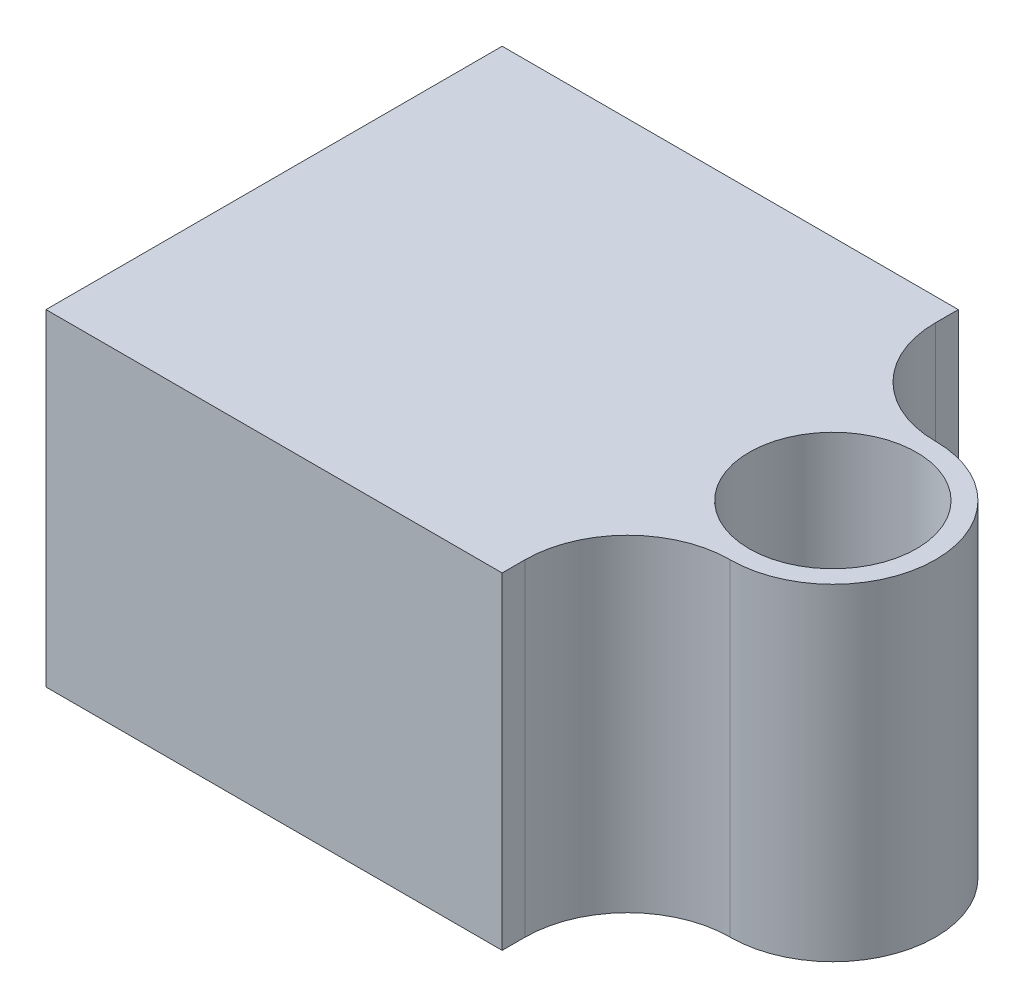
ISO-10303-21;
HEADER;
FILE_DESCRIPTION(('STEP AP214'),'2;1');
FILE_NAME('part.step','',(''),(''),'','','');
FILE_SCHEMA(('AUTOMOTIVE_DESIGN { 1 0 10303 214 1 1 1 1 }'));
ENDSEC;
DATA;
#1=APPLICATION_CONTEXT('core data for automotive mechanical design processes');
#2=APPLICATION_PROTOCOL_DEFINITION('international standard','automotive_design',2000,#1);
#3=PRODUCT_CONTEXT('',#1,'mechanical');
#4=PRODUCT('Part','Part','',(#3));
#5=PRODUCT_RELATED_PRODUCT_CATEGORY('part','',(#4));
#6=PRODUCT_DEFINITION_FORMATION('','',#4);
#7=PRODUCT_DEFINITION_CONTEXT('part definition',#1,'design');
#8=PRODUCT_DEFINITION('design','',#6,#7);
#9=PRODUCT_DEFINITION_SHAPE('','',#8);
#10=(LENGTH_UNIT() NAMED_UNIT(*) SI_UNIT(.MILLI.,.METRE.));
#11=(NAMED_UNIT(*) PLANE_ANGLE_UNIT() SI_UNIT($,.RADIAN.));
#12=(NAMED_UNIT(*) SI_UNIT($,.STERADIAN.) SOLID_ANGLE_UNIT());
#13=UNCERTAINTY_MEASURE_WITH_UNIT(LENGTH_MEASURE(1.E-05),#10,'distance_accuracy_value','');
#14=(GEOMETRIC_REPRESENTATION_CONTEXT(3) GLOBAL_UNCERTAINTY_ASSIGNED_CONTEXT((#13)) GLOBAL_UNIT_ASSIGNED_CONTEXT((#10,
#11,#12)) REPRESENTATION_CONTEXT('',''));
#15=CARTESIAN_POINT('',(0.,0.,0.));
#16=DIRECTION('',(0.,0.,1.));
#17=DIRECTION('',(1.,0.,0.));
#18=AXIS2_PLACEMENT_3D('',#15,#16,#17);
#19=CARTESIAN_POINT('',(0.,21.5,0.));
#20=DIRECTION('',(0.,-1.,0.));
#21=DIRECTION('',(0.,0.,-1.));
#22=AXIS2_PLACEMENT_3D('',#19,#20,#21);
#23=CYLINDRICAL_SURFACE('',#22,13.5);
#24=CARTESIAN_POINT('',(0.,-21.5,0.));
#25=DIRECTION('',(0.,1.,0.));
#26=DIRECTION('',(0.,0.,1.));
#27=AXIS2_PLACEMENT_3D('',#24,#25,#26);
#28=CIRCLE('',#27,13.5);
#29=CARTESIAN_POINT('',(0.,-21.5,13.5));
#30=VERTEX_POINT('',#29);
#31=CARTESIAN_POINT('',(0.,-21.5,-13.5));
#32=VERTEX_POINT('',#31);
#33=EDGE_CURVE('E198',#30,#32,#28,.T.);
#34=ORIENTED_EDGE('',*,*,#33,.T.);
#35=DIRECTION('',(0.,-1.,0.));
#36=VECTOR('',#35,1.);
#37=CARTESIAN_POINT('',(0.,21.5,-13.5));
#38=LINE('',#37,#36);
#39=CARTESIAN_POINT('',(0.,21.5,-13.5));
#40=VERTEX_POINT('',#39);
#41=EDGE_CURVE('E11',#40,#32,#38,.T.);
#42=ORIENTED_EDGE('',*,*,#41,.F.);
#43=CARTESIAN_POINT('',(0.,21.5,0.));
#44=DIRECTION('',(0.,1.,0.));
#45=DIRECTION('',(0.,0.,1.));
#46=AXIS2_PLACEMENT_3D('',#43,#44,#45);
#47=CIRCLE('',#46,13.5);
#48=CARTESIAN_POINT('',(0.,21.5,13.5));
#49=VERTEX_POINT('',#48);
#50=EDGE_CURVE('E96',#49,#40,#47,.T.);
#51=ORIENTED_EDGE('',*,*,#50,.F.);
#52=DIRECTION('',(0.,-1.,0.));
#53=VECTOR('',#52,1.);
#54=CARTESIAN_POINT('',(0.,21.5,13.5));
#55=LINE('',#54,#53);
#56=EDGE_CURVE('E58',#49,#30,#55,.T.);
#57=ORIENTED_EDGE('',*,*,#56,.T.);
#58=EDGE_LOOP('',(#34,#42,#51,#57));
#59=FACE_BOUND('',#58,.T.);
#60=ADVANCED_FACE('F41',(#59),#23,.T.);
#61=CARTESIAN_POINT('',(0.,21.5,-27.));
#62=DIRECTION('',(0.,-1.,0.));
#63=DIRECTION('',(0.,0.,-1.));
#64=AXIS2_PLACEMENT_3D('',#61,#62,#63);
#65=CYLINDRICAL_SURFACE('',#64,13.5);
#66=CARTESIAN_POINT('',(0.,-21.5,-27.));
#67=DIRECTION('',(0.,1.,0.));
#68=DIRECTION('',(0.,0.,1.));
#69=AXIS2_PLACEMENT_3D('',#66,#67,#68);
#70=CIRCLE('',#69,13.5);
#71=CARTESIAN_POINT('',(-13.5,-21.5,-27.));
#72=VERTEX_POINT('',#71);
#73=EDGE_CURVE('E191',#72,#32,#70,.T.);
#74=ORIENTED_EDGE('',*,*,#73,.F.);
#75=DIRECTION('',(0.,-1.,0.));
#76=VECTOR('',#75,1.);
#77=CARTESIAN_POINT('',(-13.5,21.5,-27.));
#78=LINE('',#77,#76);
#79=CARTESIAN_POINT('',(-13.5,21.5,-27.));
#80=VERTEX_POINT('',#79);
#81=EDGE_CURVE('E50',#80,#72,#78,.T.);
#82=ORIENTED_EDGE('',*,*,#81,.F.);
#83=CARTESIAN_POINT('',(0.,21.5,-27.));
#84=DIRECTION('',(0.,1.,0.));
#85=DIRECTION('',(0.,0.,1.));
#86=AXIS2_PLACEMENT_3D('',#83,#84,#85);
#87=CIRCLE('',#86,13.5);
#88=EDGE_CURVE('E146',#80,#40,#87,.T.);
#89=ORIENTED_EDGE('',*,*,#88,.T.);
#90=ORIENTED_EDGE('',*,*,#41,.T.);
#91=EDGE_LOOP('',(#74,#82,#89,#90));
#92=FACE_BOUND('',#91,.T.);
#93=ADVANCED_FACE('F196',(#92),#65,.F.);
#94=CARTESIAN_POINT('',(-13.5,21.5,0.));
#95=DIRECTION('',(-1.,0.,0.));
#96=DIRECTION('',(0.,0.,1.));
#97=AXIS2_PLACEMENT_3D('',#94,#95,#96);
#98=PLANE('',#97);
#99=DIRECTION('',(0.,0.,-1.));
#100=VECTOR('',#99,1.);
#101=CARTESIAN_POINT('',(-13.5,-21.5,0.));
#102=LINE('',#101,#100);
#103=CARTESIAN_POINT('',(-13.5,-21.5,-30.));
#104=VERTEX_POINT('',#103);
#105=EDGE_CURVE('E185',#72,#104,#102,.T.);
#106=ORIENTED_EDGE('',*,*,#105,.T.);
#107=DIRECTION('',(0.,-1.,0.));
#108=VECTOR('',#107,1.);
#109=CARTESIAN_POINT('',(-13.5,21.5,-30.));
#110=LINE('',#109,#108);
#111=CARTESIAN_POINT('',(-13.5,21.5,-30.));
#112=VERTEX_POINT('',#111);
#113=EDGE_CURVE('E178',#112,#104,#110,.T.);
#114=ORIENTED_EDGE('',*,*,#113,.F.);
#115=DIRECTION('',(0.,0.,-1.));
#116=VECTOR('',#115,1.);
#117=CARTESIAN_POINT('',(-13.5,21.5,0.));
#118=LINE('',#117,#116);
#119=EDGE_CURVE('E138',#80,#112,#118,.T.);
#120=ORIENTED_EDGE('',*,*,#119,.F.);
#121=ORIENTED_EDGE('',*,*,#81,.T.);
#122=EDGE_LOOP('',(#106,#114,#120,#121));
#123=FACE_BOUND('',#122,.T.);
#124=ADVANCED_FACE('F184',(#123),#98,.F.);
#125=CARTESIAN_POINT('',(0.,21.5,-30.));
#126=DIRECTION('',(0.,0.,1.));
#127=DIRECTION('',(1.,0.,0.));
#128=AXIS2_PLACEMENT_3D('',#125,#126,#127);
#129=PLANE('',#128);
#130=DIRECTION('',(-1.,0.,0.));
#131=VECTOR('',#130,1.);
#132=CARTESIAN_POINT('',(0.,-21.5,-30.));
#133=LINE('',#132,#131);
#134=CARTESIAN_POINT('',(-73.5,-21.5,-30.));
#135=VERTEX_POINT('',#134);
#136=EDGE_CURVE('E193',#104,#135,#133,.T.);
#137=ORIENTED_EDGE('',*,*,#136,.T.);
#138=DIRECTION('',(0.,-1.,0.));
#139=VECTOR('',#138,1.);
#140=CARTESIAN_POINT('',(-73.5,21.5,-30.));
#141=LINE('',#140,#139);
#142=CARTESIAN_POINT('',(-73.5,21.5,-30.));
#143=VERTEX_POINT('',#142);
#144=EDGE_CURVE('E174',#143,#135,#141,.T.);
#145=ORIENTED_EDGE('',*,*,#144,.F.);
#146=DIRECTION('',(-1.,0.,0.));
#147=VECTOR('',#146,1.);
#148=CARTESIAN_POINT('',(0.,21.5,-30.));
#149=LINE('',#148,#147);
#150=EDGE_CURVE('E145',#112,#143,#149,.T.);
#151=ORIENTED_EDGE('',*,*,#150,.F.);
#152=ORIENTED_EDGE('',*,*,#113,.T.);
#153=EDGE_LOOP('',(#137,#145,#151,#152));
#154=FACE_BOUND('',#153,.T.);
#155=ADVANCED_FACE('F228',(#154),#129,.F.);
#156=CARTESIAN_POINT('',(-73.5,21.5,0.));
#157=DIRECTION('',(1.,0.,0.));
#158=DIRECTION('',(0.,0.,-1.));
#159=AXIS2_PLACEMENT_3D('',#156,#157,#158);
#160=PLANE('',#159);
#161=DIRECTION('',(0.,0.,1.));
#162=VECTOR('',#161,1.);
#163=CARTESIAN_POINT('',(-73.5,-21.5,0.));
#164=LINE('',#163,#162);
#165=CARTESIAN_POINT('',(-73.5,-21.5,30.));
#166=VERTEX_POINT('',#165);
#167=EDGE_CURVE('E206',#135,#166,#164,.T.);
#168=ORIENTED_EDGE('',*,*,#167,.T.);
#169=DIRECTION('',(0.,-1.,0.));
#170=VECTOR('',#169,1.);
#171=CARTESIAN_POINT('',(-73.5,21.5,30.));
#172=LINE('',#171,#170);
#173=CARTESIAN_POINT('',(-73.5,21.5,30.));
#174=VERTEX_POINT('',#173);
#175=EDGE_CURVE('E132',#174,#166,#172,.T.);
#176=ORIENTED_EDGE('',*,*,#175,.F.);
#177=DIRECTION('',(0.,0.,1.));
#178=VECTOR('',#177,1.);
#179=CARTESIAN_POINT('',(-73.5,21.5,0.));
#180=LINE('',#179,#178);
#181=EDGE_CURVE('E118',#143,#174,#180,.T.);
#182=ORIENTED_EDGE('',*,*,#181,.F.);
#183=ORIENTED_EDGE('',*,*,#144,.T.);
#184=EDGE_LOOP('',(#168,#176,#182,#183));
#185=FACE_BOUND('',#184,.T.);
#186=ADVANCED_FACE('F232',(#185),#160,.F.);
#187=CARTESIAN_POINT('',(0.,21.5,30.));
#188=DIRECTION('',(0.,0.,-1.));
#189=DIRECTION('',(-1.,0.,0.));
#190=AXIS2_PLACEMENT_3D('',#187,#188,#189);
#191=PLANE('',#190);
#192=DIRECTION('',(1.,0.,0.));
#193=VECTOR('',#192,1.);
#194=CARTESIAN_POINT('',(0.,-21.5,30.));
#195=LINE('',#194,#193);
#196=CARTESIAN_POINT('',(-13.5,-21.5,30.));
#197=VERTEX_POINT('',#196);
#198=EDGE_CURVE('E128',#166,#197,#195,.T.);
#199=ORIENTED_EDGE('',*,*,#198,.T.);
#200=DIRECTION('',(0.,-1.,0.));
#201=VECTOR('',#200,1.);
#202=CARTESIAN_POINT('',(-13.5,21.5,30.));
#203=LINE('',#202,#201);
#204=CARTESIAN_POINT('',(-13.5,21.5,30.));
#205=VERTEX_POINT('',#204);
#206=EDGE_CURVE('E125',#205,#197,#203,.T.);
#207=ORIENTED_EDGE('',*,*,#206,.F.);
#208=DIRECTION('',(1.,0.,0.));
#209=VECTOR('',#208,1.);
#210=CARTESIAN_POINT('',(0.,21.5,30.));
#211=LINE('',#210,#209);
#212=EDGE_CURVE('E111',#174,#205,#211,.T.);
#213=ORIENTED_EDGE('',*,*,#212,.F.);
#214=ORIENTED_EDGE('',*,*,#175,.T.);
#215=EDGE_LOOP('',(#199,#207,#213,#214));
#216=FACE_BOUND('',#215,.T.);
#217=ADVANCED_FACE('F126',(#216),#191,.F.);
#218=CARTESIAN_POINT('',(-13.5,-21.5,27.));
#219=VERTEX_POINT('',#218);
#220=EDGE_CURVE('E164',#197,#219,#102,.T.);
#221=ORIENTED_EDGE('',*,*,#220,.T.);
#222=DIRECTION('',(0.,-1.,0.));
#223=VECTOR('',#222,1.);
#224=CARTESIAN_POINT('',(-13.5,21.5,27.));
#225=LINE('',#224,#223);
#226=CARTESIAN_POINT('',(-13.5,21.5,27.));
#227=VERTEX_POINT('',#226);
#228=EDGE_CURVE('E84',#227,#219,#225,.T.);
#229=ORIENTED_EDGE('',*,*,#228,.F.);
#230=EDGE_CURVE('E116',#205,#227,#118,.T.);
#231=ORIENTED_EDGE('',*,*,#230,.F.);
#232=ORIENTED_EDGE('',*,*,#206,.T.);
#233=EDGE_LOOP('',(#221,#229,#231,#232));
#234=FACE_BOUND('',#233,.T.);
#235=ADVANCED_FACE('F134',(#234),#98,.F.);
#236=CARTESIAN_POINT('',(0.,21.5,27.));
#237=DIRECTION('',(0.,-1.,0.));
#238=DIRECTION('',(0.,0.,-1.));
#239=AXIS2_PLACEMENT_3D('',#236,#237,#238);
#240=CYLINDRICAL_SURFACE('',#239,13.5);
#241=CARTESIAN_POINT('',(0.,-21.5,27.));
#242=DIRECTION('',(0.,1.,0.));
#243=DIRECTION('',(0.,0.,1.));
#244=AXIS2_PLACEMENT_3D('',#241,#242,#243);
#245=CIRCLE('',#244,13.5);
#246=EDGE_CURVE('E158',#30,#219,#245,.T.);
#247=ORIENTED_EDGE('',*,*,#246,.F.);
#248=ORIENTED_EDGE('',*,*,#56,.F.);
#249=CARTESIAN_POINT('',(0.,21.5,27.));
#250=DIRECTION('',(0.,1.,0.));
#251=DIRECTION('',(0.,0.,1.));
#252=AXIS2_PLACEMENT_3D('',#249,#250,#251);
#253=CIRCLE('',#252,13.5);
#254=EDGE_CURVE('E136',#49,#227,#253,.T.);
#255=ORIENTED_EDGE('',*,*,#254,.T.);
#256=ORIENTED_EDGE('',*,*,#228,.T.);
#257=EDGE_LOOP('',(#247,#248,#255,#256));
#258=FACE_BOUND('',#257,.T.);
#259=ADVANCED_FACE('F210',(#258),#240,.F.);
#260=CARTESIAN_POINT('',(0.,21.5,0.));
#261=DIRECTION('',(0.,-1.,0.));
#262=DIRECTION('',(0.,0.,-1.));
#263=AXIS2_PLACEMENT_3D('',#260,#261,#262);
#264=CYLINDRICAL_SURFACE('',#263,11.);
#265=CARTESIAN_POINT('',(0.,21.5,0.));
#266=DIRECTION('',(0.,1.,0.));
#267=DIRECTION('',(0.,0.,1.));
#268=AXIS2_PLACEMENT_3D('',#265,#266,#267);
#269=CIRCLE('',#268,11.);
#270=CARTESIAN_POINT('',(0.,21.5,11.));
#271=VERTEX_POINT('',#270);
#272=EDGE_CURVE('E140',#271,#271,#269,.T.);
#273=ORIENTED_EDGE('',*,*,#272,.T.);
#274=EDGE_LOOP('',(#273));
#275=FACE_BOUND('',#274,.T.);
#276=CARTESIAN_POINT('',(0.,-21.5,0.));
#277=DIRECTION('',(0.,1.,0.));
#278=DIRECTION('',(0.,0.,1.));
#279=AXIS2_PLACEMENT_3D('',#276,#277,#278);
#280=CIRCLE('',#279,11.);
#281=CARTESIAN_POINT('',(0.,-21.5,11.));
#282=VERTEX_POINT('',#281);
#283=EDGE_CURVE('E154',#282,#282,#280,.T.);
#284=ORIENTED_EDGE('',*,*,#283,.F.);
#285=EDGE_LOOP('',(#284));
#286=FACE_BOUND('',#285,.T.);
#287=ADVANCED_FACE('F212',(#275,#286),#264,.F.);
#288=CARTESIAN_POINT('',(0.,21.5,0.));
#289=DIRECTION('',(0.,1.,0.));
#290=DIRECTION('',(0.,0.,1.));
#291=AXIS2_PLACEMENT_3D('',#288,#289,#290);
#292=PLANE('',#291);
#293=ORIENTED_EDGE('',*,*,#50,.T.);
#294=ORIENTED_EDGE('',*,*,#88,.F.);
#295=ORIENTED_EDGE('',*,*,#119,.T.);
#296=ORIENTED_EDGE('',*,*,#150,.T.);
#297=ORIENTED_EDGE('',*,*,#181,.T.);
#298=ORIENTED_EDGE('',*,*,#212,.T.);
#299=ORIENTED_EDGE('',*,*,#230,.T.);
#300=ORIENTED_EDGE('',*,*,#254,.F.);
#301=EDGE_LOOP('',(#293,#294,#295,#296,#297,#298,#299,#300));
#302=FACE_BOUND('',#301,.T.);
#303=ORIENTED_EDGE('',*,*,#272,.F.);
#304=EDGE_LOOP('',(#303));
#305=FACE_BOUND('',#304,.T.);
#306=ADVANCED_FACE('F113',(#302,#305),#292,.T.);
#307=CARTESIAN_POINT('',(0.,-21.5,0.));
#308=DIRECTION('',(0.,1.,0.));
#309=DIRECTION('',(0.,0.,1.));
#310=AXIS2_PLACEMENT_3D('',#307,#308,#309);
#311=PLANE('',#310);
#312=ORIENTED_EDGE('',*,*,#33,.F.);
#313=ORIENTED_EDGE('',*,*,#246,.T.);
#314=ORIENTED_EDGE('',*,*,#220,.F.);
#315=ORIENTED_EDGE('',*,*,#198,.F.);
#316=ORIENTED_EDGE('',*,*,#167,.F.);
#317=ORIENTED_EDGE('',*,*,#136,.F.);
#318=ORIENTED_EDGE('',*,*,#105,.F.);
#319=ORIENTED_EDGE('',*,*,#73,.T.);
#320=EDGE_LOOP('',(#312,#313,#314,#315,#316,#317,#318,#319));
#321=FACE_BOUND('',#320,.T.);
#322=ORIENTED_EDGE('',*,*,#283,.T.);
#323=EDGE_LOOP('',(#322));
#324=FACE_BOUND('',#323,.T.);
#325=ADVANCED_FACE('F190',(#321,#324),#311,.F.);
#326=CLOSED_SHELL('',(#60,#93,#124,#155,#186,#217,#235,#259,#287,#306,#325));
#327=MANIFOLD_SOLID_BREP('B2',#326);
#328=ADVANCED_BREP_SHAPE_REPRESENTATION('',(#18,#327),#14);
#329=SHAPE_DEFINITION_REPRESENTATION(#9,#328);
ENDSEC;
END-ISO-10303-21;
